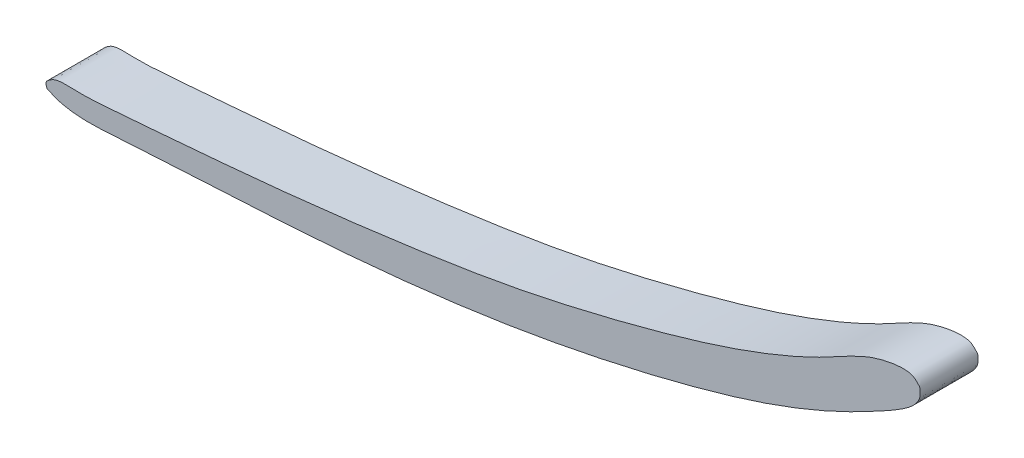
ISO-10303-21;
HEADER;
FILE_DESCRIPTION(('STEP AP214'),'2;1');
FILE_NAME('part.step','',(''),(''),'','','');
FILE_SCHEMA(('AUTOMOTIVE_DESIGN { 1 0 10303 214 1 1 1 1 }'));
ENDSEC;
DATA;
#1=APPLICATION_CONTEXT('core data for automotive mechanical design processes');
#2=APPLICATION_PROTOCOL_DEFINITION('international standard','automotive_design',2000,#1);
#3=PRODUCT_CONTEXT('',#1,'mechanical');
#4=PRODUCT('Part','Part','',(#3));
#5=PRODUCT_RELATED_PRODUCT_CATEGORY('part','',(#4));
#6=PRODUCT_DEFINITION_FORMATION('','',#4);
#7=PRODUCT_DEFINITION_CONTEXT('part definition',#1,'design');
#8=PRODUCT_DEFINITION('design','',#6,#7);
#9=PRODUCT_DEFINITION_SHAPE('','',#8);
#10=(LENGTH_UNIT() NAMED_UNIT(*) SI_UNIT(.MILLI.,.METRE.));
#11=(NAMED_UNIT(*) PLANE_ANGLE_UNIT() SI_UNIT($,.RADIAN.));
#12=(NAMED_UNIT(*) SI_UNIT($,.STERADIAN.) SOLID_ANGLE_UNIT());
#13=UNCERTAINTY_MEASURE_WITH_UNIT(LENGTH_MEASURE(1.E-05),#10,'distance_accuracy_value','');
#14=(GEOMETRIC_REPRESENTATION_CONTEXT(3) GLOBAL_UNCERTAINTY_ASSIGNED_CONTEXT((#13)) GLOBAL_UNIT_ASSIGNED_CONTEXT((#10,
#11,#12)) REPRESENTATION_CONTEXT('',''));
#15=CARTESIAN_POINT('',(0.,0.,0.));
#16=DIRECTION('',(0.,0.,1.));
#17=DIRECTION('',(1.,0.,0.));
#18=AXIS2_PLACEMENT_3D('',#15,#16,#17);
#19=CARTESIAN_POINT('',(67.9244180293989,0.,380.));
#20=CARTESIAN_POINT('',(67.8980827226914,0.0808874846875418,380.));
#21=CARTESIAN_POINT('',(67.8437519870506,0.146183378526621,380.));
#22=CARTESIAN_POINT('',(67.7304105694721,0.269860576595671,380.));
#23=CARTESIAN_POINT('',(67.6701066992551,0.328142792930919,380.));
#24=CARTESIAN_POINT('',(67.4930767753871,0.506789097964422,380.));
#25=CARTESIAN_POINT('',(67.3754815860878,0.627722730379698,380.));
#26=CARTESIAN_POINT('',(67.1814988715481,0.784949433293214,380.));
#27=CARTESIAN_POINT('',(67.1142900629273,0.833628055077473,380.));
#28=CARTESIAN_POINT('',(66.9708815776387,0.91782214535624,380.));
#29=CARTESIAN_POINT('',(66.8942977170675,0.954020744017403,380.));
#30=CARTESIAN_POINT('',(66.6585955543259,1.04458627408283,380.));
#31=CARTESIAN_POINT('',(66.4960970471957,1.08095822861115,380.));
#32=CARTESIAN_POINT('',(66.1659121181836,1.13048393172016,380.));
#33=CARTESIAN_POINT('',(65.9978237521445,1.14287797467205,380.));
#34=CARTESIAN_POINT('',(65.66484948565,1.15506162313816,380.));
#35=CARTESIAN_POINT('',(65.4989041745106,1.1543912544717,380.));
#36=CARTESIAN_POINT('',(65.0024970619218,1.13454779735811,380.));
#37=CARTESIAN_POINT('',(64.673328211938,1.09923807089962,380.));
#38=CARTESIAN_POINT('',(63.688316162584,0.962176359305011,380.));
#39=CARTESIAN_POINT('',(63.0347744470589,0.823029122241969,380.));
#40=CARTESIAN_POINT('',(61.7631205156361,0.476424362996053,380.));
#41=CARTESIAN_POINT('',(61.1416513865985,0.265644883098992,380.));
#42=CARTESIAN_POINT('',(59.3175463598382,-0.471891549475023,380.));
#43=CARTESIAN_POINT('',(58.1516567934419,-1.0946192132435,380.));
#44=CARTESIAN_POINT('',(56.4078281872059,-2.0415569353226,380.));
#45=CARTESIAN_POINT('',(55.8267903228693,-2.35781949207936,380.));
#46=CARTESIAN_POINT('',(54.6590962842587,-2.97580839573625,380.));
#47=CARTESIAN_POINT('',(54.0728248060745,-3.27853006385465,380.));
#48=CARTESIAN_POINT('',(52.3016449875141,-4.1547022057839,380.));
#49=CARTESIAN_POINT('',(51.1052447977944,-4.69841990665093,380.));
#50=CARTESIAN_POINT('',(48.6920494064283,-5.73308745173379,380.));
#51=CARTESIAN_POINT('',(47.4752601060874,-6.22405256435216,380.));
#52=CARTESIAN_POINT('',(43.802122786914,-7.6380367626937,380.));
#53=CARTESIAN_POINT('',(41.3193006166478,-8.49255948112776,380.));
#54=CARTESIAN_POINT('',(36.3035244346295,-10.0718991921712,380.));
#55=CARTESIAN_POINT('',(33.7722339214249,-10.8027024115782,380.));
#56=CARTESIAN_POINT('',(28.6849421482247,-12.1932145904519,380.));
#57=CARTESIAN_POINT('',(26.1305894174891,-12.8490705617333,380.));
#58=CARTESIAN_POINT('',(21.0059725680642,-14.0927192451237,380.));
#59=CARTESIAN_POINT('',(18.4363683137439,-14.6815677266137,380.));
#60=CARTESIAN_POINT('',(13.277492574711,-15.7703722846294,380.));
#61=CARTESIAN_POINT('',(10.6869040238936,-16.2678786080086,380.));
#62=CARTESIAN_POINT('',(5.49185483006941,-17.1706653348124,380.));
#63=CARTESIAN_POINT('',(2.88703857969561,-17.576972694024,380.));
#64=CARTESIAN_POINT('',(-2.3314338448699,-18.3349280893757,380.));
#65=CARTESIAN_POINT('',(-4.94461578611242,-18.6890100645052,380.));
#66=CARTESIAN_POINT('',(-10.174693939845,-19.3631406923846,380.));
#67=CARTESIAN_POINT('',(-12.7921525690243,-19.6810476511114,380.));
#68=CARTESIAN_POINT('',(-18.0321591835003,-20.2765633316638,380.));
#69=CARTESIAN_POINT('',(-20.654566234495,-20.550964155242,380.));
#70=CARTESIAN_POINT('',(-25.9032946001612,-21.0592774586322,380.));
#71=CARTESIAN_POINT('',(-28.5295173927531,-21.2950567597201,380.));
#72=CARTESIAN_POINT('',(-33.7837383558722,-21.7466130770187,380.));
#73=CARTESIAN_POINT('',(-36.4114006599268,-21.966004972311,380.));
#74=CARTESIAN_POINT('',(-40.3533834380296,-22.2890158777061,380.));
#75=CARTESIAN_POINT('',(-41.667553943192,-22.3945127438023,380.));
#76=CARTESIAN_POINT('',(-43.6393465195499,-22.5459233878259,380.));
#77=CARTESIAN_POINT('',(-44.2965407817983,-22.597458987013,380.));
#78=CARTESIAN_POINT('',(-45.6115064645182,-22.6919723447671,380.));
#79=CARTESIAN_POINT('',(-46.269485584589,-22.7353017031554,380.));
#80=CARTESIAN_POINT('',(-47.5870515146375,-22.783315661573,380.));
#81=CARTESIAN_POINT('',(-48.2457845167023,-22.7892769629878,380.));
#82=CARTESIAN_POINT('',(-49.2337857967943,-22.7627426197818,380.));
#83=CARTESIAN_POINT('',(-49.5631030685538,-22.7479425863981,380.));
#84=CARTESIAN_POINT('',(-50.2217925768605,-22.7381947634276,380.));
#85=CARTESIAN_POINT('',(-50.5513862645487,-22.7417875994527,380.));
#86=CARTESIAN_POINT('',(-51.0409658661352,-22.7870841953343,380.));
#87=CARTESIAN_POINT('',(-51.2033952206051,-22.8094190572499,380.));
#88=CARTESIAN_POINT('',(-51.5255736707704,-22.87947916336,380.));
#89=CARTESIAN_POINT('',(-51.6854844122682,-22.9277310801552,380.));
#90=CARTESIAN_POINT('',(-52.1340436819776,-23.1229409127101,380.));
#91=CARTESIAN_POINT('',(-52.4000778156136,-23.3211673184696,380.));
#92=CARTESIAN_POINT('',(-52.7204285614589,-23.5797172412932,380.));
#93=CARTESIAN_POINT('',(-52.7835989471737,-23.6371788054526,380.));
#94=CARTESIAN_POINT('',(-52.8609317331312,-23.783056290879,380.));
#95=CARTESIAN_POINT('',(-52.8776269809649,-23.8681547258022,380.));
#96=CARTESIAN_POINT('',(-52.8715545015156,-24.0335292293888,380.));
#97=CARTESIAN_POINT('',(-52.8543065940292,-24.1140071087037,380.));
#98=CARTESIAN_POINT('',(-52.819816431829,-24.2749637461241,380.));
#99=CARTESIAN_POINT('',(-52.7987122713346,-24.3553434026731,380.));
#100=CARTESIAN_POINT('',(-52.742657187952,-24.4660269903957,380.));
#101=CARTESIAN_POINT('',(-52.7200670390676,-24.5007146199069,380.));
#102=CARTESIAN_POINT('',(-52.6643555107444,-24.5614175002645,380.));
#103=CARTESIAN_POINT('',(-52.6307382072656,-24.5865128134026,380.));
#104=CARTESIAN_POINT('',(-52.5237629838539,-24.6484163666789,380.));
#105=CARTESIAN_POINT('',(-52.4441309452042,-24.6740515357303,380.));
#106=CARTESIAN_POINT('',(-52.2093059160125,-24.753707358067,380.));
#107=CARTESIAN_POINT('',(-52.0558576854918,-24.8148180878672,380.));
#108=CARTESIAN_POINT('',(-51.7507797415351,-24.9424417890892,380.));
#109=CARTESIAN_POINT('',(-51.5987251041437,-25.0080318992665,380.));
#110=CARTESIAN_POINT('',(-51.290772308899,-25.1251004348166,380.));
#111=CARTESIAN_POINT('',(-51.1348283305039,-25.1764106276925,380.));
#112=CARTESIAN_POINT('',(-50.6621648811304,-25.3126020512847,380.));
#113=CARTESIAN_POINT('',(-50.3410490393522,-25.3813417784947,380.));
#114=CARTESIAN_POINT('',(-49.6929316073853,-25.4972114022308,380.));
#115=CARTESIAN_POINT('',(-49.3650582179808,-25.5440624306643,380.));
#116=CARTESIAN_POINT('',(-48.7111807635962,-25.6162860552686,380.));
#117=CARTESIAN_POINT('',(-48.3844158061056,-25.6417629071474,380.));
#118=CARTESIAN_POINT('',(-47.4045544693038,-25.6916604443526,380.));
#119=CARTESIAN_POINT('',(-46.7518807319356,-25.6902148233248,380.));
#120=CARTESIAN_POINT('',(-45.4470076893009,-25.658287641293,380.));
#121=CARTESIAN_POINT('',(-44.7948204891251,-25.6270652309978,380.));
#122=CARTESIAN_POINT('',(-42.8385442609433,-25.5159327943076,380.));
#123=CARTESIAN_POINT('',(-41.5347008586148,-25.4233457781483,380.));
#124=CARTESIAN_POINT('',(-38.9266033551757,-25.252628281677,380.));
#125=CARTESIAN_POINT('',(-37.6222865569631,-25.1718480158558,380.));
#126=CARTESIAN_POINT('',(-33.7083709871079,-24.9459933052223,380.));
#127=CARTESIAN_POINT('',(-31.09784190331,-24.8168154822398,380.));
#128=CARTESIAN_POINT('',(-25.8774191166827,-24.5476030146287,380.));
#129=CARTESIAN_POINT('',(-23.2675635611287,-24.4068889053126,380.));
#130=CARTESIAN_POINT('',(-15.4412738590346,-23.9284982139152,380.));
#131=CARTESIAN_POINT('',(-10.227975643508,-23.5297512921371,380.));
#132=CARTESIAN_POINT('',(0.171861577279261,-22.4787884299001,380.));
#133=CARTESIAN_POINT('',(5.36158421555895,-21.8286977470625,380.));
#134=CARTESIAN_POINT('',(15.6861379450761,-20.2077649700896,380.));
#135=CARTESIAN_POINT('',(20.8250483209451,-19.2342938444913,380.));
#136=CARTESIAN_POINT('',(28.4842509671916,-17.5503560973159,380.));
#137=CARTESIAN_POINT('',(31.0289682578763,-16.9526079214017,380.));
#138=CARTESIAN_POINT('',(36.0951670774016,-15.6736609981585,380.));
#139=CARTESIAN_POINT('',(38.6173290505716,-14.9929346244229,380.));
#140=CARTESIAN_POINT('',(43.6299990832301,-13.5120922824956,380.));
#141=CARTESIAN_POINT('',(46.1208815122643,-12.7102674049742,380.));
#142=CARTESIAN_POINT('',(51.0348905763456,-10.9288799551273,380.));
#143=CARTESIAN_POINT('',(53.460709519367,-9.94493226941651,380.));
#144=CARTESIAN_POINT('',(58.216695925139,-7.77139023146861,380.));
#145=CARTESIAN_POINT('',(60.5482348546552,-6.58039438604385,380.));
#146=CARTESIAN_POINT('',(63.407986552383,-4.99579766464203,380.));
#147=CARTESIAN_POINT('',(63.9773652085571,-4.6737798244359,380.));
#148=CARTESIAN_POINT('',(64.8197193275285,-4.17151824312584,380.));
#149=CARTESIAN_POINT('',(65.0981769738753,-4.00033252500465,380.));
#150=CARTESIAN_POINT('',(65.6471020402947,-3.64503287526685,380.));
#151=CARTESIAN_POINT('',(65.918296833539,-3.4613934899273,380.));
#152=CARTESIAN_POINT('',(66.440436881978,-3.07157367314159,380.));
#153=CARTESIAN_POINT('',(66.6917500987747,-2.86521847424187,380.));
#154=CARTESIAN_POINT('',(67.1607368865974,-2.41304685703808,380.));
#155=CARTESIAN_POINT('',(67.3792315044415,-2.16317357826379,380.));
#156=CARTESIAN_POINT('',(67.6532757442726,-1.75518143493458,380.));
#157=CARTESIAN_POINT('',(67.7366153324638,-1.61301989194684,380.));
#158=CARTESIAN_POINT('',(67.8723550774667,-1.3121248681926,380.));
#159=CARTESIAN_POINT('',(67.9239269601411,-1.15720611076292,380.));
#160=CARTESIAN_POINT('',(67.9681872852655,-0.831214314116757,380.));
#161=CARTESIAN_POINT('',(67.9575759373682,-0.662942903009611,380.));
#162=CARTESIAN_POINT('',(67.9454282445663,-0.414328954666865,380.));
#163=CARTESIAN_POINT('',(67.9450805277485,-0.33132380475509,380.));
#164=CARTESIAN_POINT('',(67.9464783944526,-0.165237818516351,380.));
#165=CARTESIAN_POINT('',(67.9507533361064,-0.0808874846875418,380.));
#166=CARTESIAN_POINT('',(67.9244180293989,0.,380.));
#167=B_SPLINE_CURVE_WITH_KNOTS('',3,(#19,#20,#21,#22,#23,#24,#25,#26,#27,#28,#29,#30,#31,#32,
#33,#34,#35,#36,#37,#38,#39,#40,#41,#42,#43,#44,#45,#46,#47,#48,#49,#50,#51,#52,#53,#54,#55,#56,
#57,#58,#59,#60,#61,#62,#63,#64,#65,#66,#67,#68,#69,#70,#71,#72,#73,#74,#75,#76,#77,#78,#79,#80,
#81,#82,#83,#84,#85,#86,#87,#88,#89,#90,#91,#92,#93,#94,#95,#96,#97,#98,#99,#100,#101,#102,#103,
#104,#105,#106,#107,#108,#109,#110,#111,#112,#113,#114,#115,#116,#117,#118,#119,#120,#121,#122,
#123,#124,#125,#126,#127,#128,#129,#130,#131,#132,#133,#134,#135,#136,#137,#138,#139,#140,#141,
#142,#143,#144,#145,#146,#147,#148,#149,#150,#151,#152,#153,#154,#155,#156,#157,#158,#159,#160,
#161,#162,#163,#164,#165,#166),.UNSPECIFIED.,.T.,.F.,(4,2,2,2,2,2,2,2,2,2,2,2,2,2,2,2,2,2,2,2,2,
2,2,2,2,2,2,2,2,2,2,2,2,2,2,2,2,2,2,2,2,2,2,2,2,2,2,2,2,2,2,2,2,2,2,2,2,2,2,2,2,2,2,2,2,2,2,2,2,
2,2,2,2,4),(0.,0.000976562499999842,0.00195312499999968,0.00390624999999948,0.00488281249999938,
0.00585937499999928,0.00781249999999923,0.00976562499999918,0.0117187499999991,
0.0156249999999992,0.0234374999999991,0.0312499999999991,0.0468749999999989,0.0546874999999989,
0.0624999999999988,0.0781249999999985,0.0937499999999983,0.124999999999998,0.156249999999998,
0.187499999999997,0.218749999999997,0.249999999999996,0.281249999999996,0.312499999999996,
0.343749999999995,0.374999999999995,0.406249999999995,0.437499999999995,0.453124999999994,
0.460937499999994,0.468749999999994,0.476562499999994,0.480468749999994,0.484374999999994,
0.486328124999994,0.488281249999994,0.492187499999994,0.493164062499994,0.494140624999994,
0.495117187499994,0.496093749999994,0.496582031249994,0.497070312499994,0.498046874999994,
0.499999999999994,0.501953124999994,0.503906249999994,0.507812499999994,0.511718749999994,
0.515624999999994,0.523437499999994,0.531249999999994,0.546874999999995,0.562499999999995,
0.593749999999995,0.624999999999996,0.687499999999996,0.749999999999997,0.812499999999998,
0.843749999999998,0.874999999999998,0.906249999999998,0.937499999999999,0.968749999999999,
0.976562499999999,0.980468749999999,0.984375,0.98828125,0.9921875,0.994140625,0.99609375,
0.998046875,0.9990234375,1.),.UNSPECIFIED.);
#168=DIRECTION('',(0.,0.,-1.));
#169=VECTOR('',#168,1.);
#170=SURFACE_OF_LINEAR_EXTRUSION('',#167,#169);
#171=CARTESIAN_POINT('',(67.9244180293989,0.,380.));
#172=CARTESIAN_POINT('',(67.9507533361064,-0.0808874846875418,380.));
#173=CARTESIAN_POINT('',(67.9464783944526,-0.165237818516351,380.));
#174=CARTESIAN_POINT('',(67.9450805277485,-0.33132380475509,380.));
#175=CARTESIAN_POINT('',(67.9454282445663,-0.414328954666865,380.));
#176=CARTESIAN_POINT('',(67.9575759373682,-0.662942903009611,380.));
#177=CARTESIAN_POINT('',(67.9681872852655,-0.831214314116757,380.));
#178=CARTESIAN_POINT('',(67.9239269601411,-1.15720611076292,380.));
#179=CARTESIAN_POINT('',(67.8723550774667,-1.3121248681926,380.));
#180=CARTESIAN_POINT('',(67.7366153324638,-1.61301989194684,380.));
#181=CARTESIAN_POINT('',(67.6532757442726,-1.75518143493458,380.));
#182=CARTESIAN_POINT('',(67.3792315044415,-2.16317357826379,380.));
#183=CARTESIAN_POINT('',(67.1607368865974,-2.41304685703808,380.));
#184=CARTESIAN_POINT('',(66.6917500987747,-2.86521847424187,380.));
#185=CARTESIAN_POINT('',(66.440436881978,-3.07157367314159,380.));
#186=CARTESIAN_POINT('',(65.918296833539,-3.4613934899273,380.));
#187=CARTESIAN_POINT('',(65.6471020402947,-3.64503287526685,380.));
#188=CARTESIAN_POINT('',(65.0981769738753,-4.00033252500465,380.));
#189=CARTESIAN_POINT('',(64.8197193275285,-4.17151824312584,380.));
#190=CARTESIAN_POINT('',(63.9773652085571,-4.6737798244359,380.));
#191=CARTESIAN_POINT('',(63.407986552383,-4.99579766464203,380.));
#192=CARTESIAN_POINT('',(60.5482348546552,-6.58039438604385,380.));
#193=CARTESIAN_POINT('',(58.216695925139,-7.77139023146861,380.));
#194=CARTESIAN_POINT('',(53.460709519367,-9.94493226941651,380.));
#195=CARTESIAN_POINT('',(51.0348905763456,-10.9288799551273,380.));
#196=CARTESIAN_POINT('',(46.1208815122643,-12.7102674049742,380.));
#197=CARTESIAN_POINT('',(43.6299990832301,-13.5120922824956,380.));
#198=CARTESIAN_POINT('',(38.6173290505716,-14.9929346244229,380.));
#199=CARTESIAN_POINT('',(36.0951670774016,-15.6736609981585,380.));
#200=CARTESIAN_POINT('',(31.0289682578763,-16.9526079214017,380.));
#201=CARTESIAN_POINT('',(28.4842509671916,-17.5503560973159,380.));
#202=CARTESIAN_POINT('',(20.8250483209451,-19.2342938444913,380.));
#203=CARTESIAN_POINT('',(15.6861379450761,-20.2077649700896,380.));
#204=CARTESIAN_POINT('',(5.36158421555895,-21.8286977470625,380.));
#205=CARTESIAN_POINT('',(0.171861577279261,-22.4787884299001,380.));
#206=CARTESIAN_POINT('',(-10.227975643508,-23.5297512921371,380.));
#207=CARTESIAN_POINT('',(-15.4412738590346,-23.9284982139152,380.));
#208=CARTESIAN_POINT('',(-23.2675635611287,-24.4068889053126,380.));
#209=CARTESIAN_POINT('',(-25.8774191166827,-24.5476030146287,380.));
#210=CARTESIAN_POINT('',(-31.09784190331,-24.8168154822398,380.));
#211=CARTESIAN_POINT('',(-33.7083709871079,-24.9459933052223,380.));
#212=CARTESIAN_POINT('',(-37.6222865569631,-25.1718480158558,380.));
#213=CARTESIAN_POINT('',(-38.9266033551757,-25.252628281677,380.));
#214=CARTESIAN_POINT('',(-41.5347008586148,-25.4233457781483,380.));
#215=CARTESIAN_POINT('',(-42.8385442609433,-25.5159327943076,380.));
#216=CARTESIAN_POINT('',(-44.7948204891251,-25.6270652309978,380.));
#217=CARTESIAN_POINT('',(-45.4470076893009,-25.658287641293,380.));
#218=CARTESIAN_POINT('',(-46.7518807319356,-25.6902148233248,380.));
#219=CARTESIAN_POINT('',(-47.4045544693038,-25.6916604443526,380.));
#220=CARTESIAN_POINT('',(-48.3844158061056,-25.6417629071474,380.));
#221=CARTESIAN_POINT('',(-48.7111807635962,-25.6162860552686,380.));
#222=CARTESIAN_POINT('',(-49.3650582179808,-25.5440624306643,380.));
#223=CARTESIAN_POINT('',(-49.6929316073853,-25.4972114022308,380.));
#224=CARTESIAN_POINT('',(-50.3410490393522,-25.3813417784947,380.));
#225=CARTESIAN_POINT('',(-50.6621648811304,-25.3126020512847,380.));
#226=CARTESIAN_POINT('',(-51.1348283305039,-25.1764106276925,380.));
#227=CARTESIAN_POINT('',(-51.290772308899,-25.1251004348166,380.));
#228=CARTESIAN_POINT('',(-51.5987251041437,-25.0080318992665,380.));
#229=CARTESIAN_POINT('',(-51.7507797415351,-24.9424417890892,380.));
#230=CARTESIAN_POINT('',(-52.0558576854918,-24.8148180878672,380.));
#231=CARTESIAN_POINT('',(-52.2093059160125,-24.753707358067,380.));
#232=CARTESIAN_POINT('',(-52.4441309452042,-24.6740515357303,380.));
#233=CARTESIAN_POINT('',(-52.5237629838539,-24.6484163666789,380.));
#234=CARTESIAN_POINT('',(-52.6307382072656,-24.5865128134026,380.));
#235=CARTESIAN_POINT('',(-52.6643555107444,-24.5614175002645,380.));
#236=CARTESIAN_POINT('',(-52.7200670390676,-24.5007146199069,380.));
#237=CARTESIAN_POINT('',(-52.742657187952,-24.4660269903957,380.));
#238=CARTESIAN_POINT('',(-52.7987122713346,-24.3553434026731,380.));
#239=CARTESIAN_POINT('',(-52.819816431829,-24.2749637461241,380.));
#240=CARTESIAN_POINT('',(-52.8543065940292,-24.1140071087037,380.));
#241=CARTESIAN_POINT('',(-52.8715545015156,-24.0335292293888,380.));
#242=CARTESIAN_POINT('',(-52.8776269809649,-23.8681547258022,380.));
#243=CARTESIAN_POINT('',(-52.8609317331312,-23.783056290879,380.));
#244=CARTESIAN_POINT('',(-52.7835989471737,-23.6371788054526,380.));
#245=CARTESIAN_POINT('',(-52.7204285614589,-23.5797172412932,380.));
#246=CARTESIAN_POINT('',(-52.4000778156136,-23.3211673184696,380.));
#247=CARTESIAN_POINT('',(-52.1340436819776,-23.1229409127101,380.));
#248=CARTESIAN_POINT('',(-51.6854844122682,-22.9277310801552,380.));
#249=CARTESIAN_POINT('',(-51.5255736707704,-22.87947916336,380.));
#250=CARTESIAN_POINT('',(-51.2033952206051,-22.8094190572499,380.));
#251=CARTESIAN_POINT('',(-51.0409658661352,-22.7870841953343,380.));
#252=CARTESIAN_POINT('',(-50.5513862645487,-22.7417875994527,380.));
#253=CARTESIAN_POINT('',(-50.2217925768605,-22.7381947634276,380.));
#254=CARTESIAN_POINT('',(-49.5631030685538,-22.7479425863981,380.));
#255=CARTESIAN_POINT('',(-49.2337857967943,-22.7627426197818,380.));
#256=CARTESIAN_POINT('',(-48.2457845167023,-22.7892769629878,380.));
#257=CARTESIAN_POINT('',(-47.5870515146375,-22.783315661573,380.));
#258=CARTESIAN_POINT('',(-46.269485584589,-22.7353017031554,380.));
#259=CARTESIAN_POINT('',(-45.6115064645182,-22.6919723447671,380.));
#260=CARTESIAN_POINT('',(-44.2965407817983,-22.597458987013,380.));
#261=CARTESIAN_POINT('',(-43.6393465195499,-22.5459233878259,380.));
#262=CARTESIAN_POINT('',(-41.667553943192,-22.3945127438023,380.));
#263=CARTESIAN_POINT('',(-40.3533834380296,-22.2890158777061,380.));
#264=CARTESIAN_POINT('',(-36.4114006599268,-21.966004972311,380.));
#265=CARTESIAN_POINT('',(-33.7837383558722,-21.7466130770187,380.));
#266=CARTESIAN_POINT('',(-28.5295173927531,-21.2950567597201,380.));
#267=CARTESIAN_POINT('',(-25.9032946001612,-21.0592774586322,380.));
#268=CARTESIAN_POINT('',(-20.654566234495,-20.550964155242,380.));
#269=CARTESIAN_POINT('',(-18.0321591835003,-20.2765633316638,380.));
#270=CARTESIAN_POINT('',(-12.7921525690243,-19.6810476511114,380.));
#271=CARTESIAN_POINT('',(-10.174693939845,-19.3631406923846,380.));
#272=CARTESIAN_POINT('',(-4.94461578611242,-18.6890100645052,380.));
#273=CARTESIAN_POINT('',(-2.3314338448699,-18.3349280893757,380.));
#274=CARTESIAN_POINT('',(2.88703857969561,-17.576972694024,380.));
#275=CARTESIAN_POINT('',(5.49185483006941,-17.1706653348124,380.));
#276=CARTESIAN_POINT('',(10.6869040238936,-16.2678786080086,380.));
#277=CARTESIAN_POINT('',(13.277492574711,-15.7703722846294,380.));
#278=CARTESIAN_POINT('',(18.4363683137439,-14.6815677266137,380.));
#279=CARTESIAN_POINT('',(21.0059725680642,-14.0927192451237,380.));
#280=CARTESIAN_POINT('',(26.1305894174891,-12.8490705617333,380.));
#281=CARTESIAN_POINT('',(28.6849421482247,-12.1932145904519,380.));
#282=CARTESIAN_POINT('',(33.7722339214249,-10.8027024115782,380.));
#283=CARTESIAN_POINT('',(36.3035244346295,-10.0718991921712,380.));
#284=CARTESIAN_POINT('',(41.3193006166478,-8.49255948112776,380.));
#285=CARTESIAN_POINT('',(43.802122786914,-7.6380367626937,380.));
#286=CARTESIAN_POINT('',(47.4752601060874,-6.22405256435216,380.));
#287=CARTESIAN_POINT('',(48.6920494064283,-5.73308745173379,380.));
#288=CARTESIAN_POINT('',(51.1052447977944,-4.69841990665093,380.));
#289=CARTESIAN_POINT('',(52.3016449875141,-4.1547022057839,380.));
#290=CARTESIAN_POINT('',(54.0728248060745,-3.27853006385465,380.));
#291=CARTESIAN_POINT('',(54.6590962842587,-2.97580839573625,380.));
#292=CARTESIAN_POINT('',(55.8267903228693,-2.35781949207936,380.));
#293=CARTESIAN_POINT('',(56.4078281872059,-2.0415569353226,380.));
#294=CARTESIAN_POINT('',(58.1516567934419,-1.0946192132435,380.));
#295=CARTESIAN_POINT('',(59.3175463598382,-0.471891549475023,380.));
#296=CARTESIAN_POINT('',(61.1416513865985,0.265644883098992,380.));
#297=CARTESIAN_POINT('',(61.7631205156361,0.476424362996053,380.));
#298=CARTESIAN_POINT('',(63.0347744470589,0.823029122241969,380.));
#299=CARTESIAN_POINT('',(63.688316162584,0.962176359305011,380.));
#300=CARTESIAN_POINT('',(64.673328211938,1.09923807089962,380.));
#301=CARTESIAN_POINT('',(65.0024970619218,1.13454779735811,380.));
#302=CARTESIAN_POINT('',(65.4989041745106,1.1543912544717,380.));
#303=CARTESIAN_POINT('',(65.66484948565,1.15506162313816,380.));
#304=CARTESIAN_POINT('',(65.9978237521445,1.14287797467205,380.));
#305=CARTESIAN_POINT('',(66.1659121181836,1.13048393172016,380.));
#306=CARTESIAN_POINT('',(66.4960970471957,1.08095822861115,380.));
#307=CARTESIAN_POINT('',(66.6585955543259,1.04458627408283,380.));
#308=CARTESIAN_POINT('',(66.8942977170675,0.954020744017403,380.));
#309=CARTESIAN_POINT('',(66.9708815776387,0.91782214535624,380.));
#310=CARTESIAN_POINT('',(67.1142900629273,0.833628055077473,380.));
#311=CARTESIAN_POINT('',(67.1814988715481,0.784949433293214,380.));
#312=CARTESIAN_POINT('',(67.3754815860878,0.627722730379698,380.));
#313=CARTESIAN_POINT('',(67.4930767753871,0.506789097964422,380.));
#314=CARTESIAN_POINT('',(67.6701066992551,0.328142792930919,380.));
#315=CARTESIAN_POINT('',(67.7304105694721,0.269860576595671,380.));
#316=CARTESIAN_POINT('',(67.8437519870506,0.146183378526621,380.));
#317=CARTESIAN_POINT('',(67.8980827226914,0.0808874846875418,380.));
#318=CARTESIAN_POINT('',(67.9244180293989,0.,380.));
#319=B_SPLINE_CURVE_WITH_KNOTS('',3,(#171,#172,#173,#174,#175,#176,#177,#178,#179,#180,#181,
#182,#183,#184,#185,#186,#187,#188,#189,#190,#191,#192,#193,#194,#195,#196,#197,#198,#199,#200,
#201,#202,#203,#204,#205,#206,#207,#208,#209,#210,#211,#212,#213,#214,#215,#216,#217,#218,#219,
#220,#221,#222,#223,#224,#225,#226,#227,#228,#229,#230,#231,#232,#233,#234,#235,#236,#237,#238,
#239,#240,#241,#242,#243,#244,#245,#246,#247,#248,#249,#250,#251,#252,#253,#254,#255,#256,#257,
#258,#259,#260,#261,#262,#263,#264,#265,#266,#267,#268,#269,#270,#271,#272,#273,#274,#275,#276,
#277,#278,#279,#280,#281,#282,#283,#284,#285,#286,#287,#288,#289,#290,#291,#292,#293,#294,#295,
#296,#297,#298,#299,#300,#301,#302,#303,#304,#305,#306,#307,#308,#309,#310,#311,#312,#313,#314,
#315,#316,#317,#318),.UNSPECIFIED.,.T.,.F.,(4,2,2,2,2,2,2,2,2,2,2,2,2,2,2,2,2,2,2,2,2,2,2,2,2,2,
2,2,2,2,2,2,2,2,2,2,2,2,2,2,2,2,2,2,2,2,2,2,2,2,2,2,2,2,2,2,2,2,2,2,2,2,2,2,2,2,2,2,2,2,2,2,2,
4),(0.,0.000976562500000111,0.00195312500000011,0.00390625000000011,0.00585937500000011,
0.00781250000000022,0.0117187500000003,0.0156250000000004,0.0195312500000007,0.0234375000000008,
0.031250000000001,0.0625000000000012,0.0937500000000016,0.125000000000002,0.156250000000002,
0.187500000000002,0.250000000000003,0.312500000000004,0.375000000000004,0.406250000000005,
0.437500000000005,0.453125000000005,0.468750000000006,0.476562500000006,0.484375000000006,
0.488281250000006,0.492187500000006,0.496093750000006,0.498046875000006,0.500000000000006,
0.501953125000006,0.502929687500006,0.503417968750006,0.503906250000006,0.504882812500006,
0.505859375000006,0.506835937500006,0.507812500000006,0.511718750000006,0.513671875000006,
0.515625000000006,0.519531250000006,0.523437500000006,0.531250000000006,0.539062500000006,
0.546875000000006,0.562500000000005,0.593750000000005,0.625000000000005,0.656250000000005,
0.687500000000004,0.718750000000004,0.750000000000004,0.781250000000003,0.812500000000003,
0.843750000000002,0.875000000000002,0.906250000000002,0.921875000000001,0.937500000000001,
0.945312500000001,0.953125000000001,0.968750000000001,0.976562500000001,0.984375000000001,
0.988281250000001,0.990234375000001,0.992187500000001,0.994140625000001,0.995117187500001,
0.996093750000001,0.998046875,0.9990234375,1.),.UNSPECIFIED.);
#320=CARTESIAN_POINT('',(67.9244180293989,0.,380.));
#321=VERTEX_POINT('',#320);
#322=EDGE_CURVE('E10',#321,#321,#319,.F.);
#323=ORIENTED_EDGE('',*,*,#322,.F.);
#324=EDGE_LOOP('',(#323));
#325=FACE_BOUND('',#324,.T.);
#326=CARTESIAN_POINT('',(67.9244180293989,0.,372.));
#327=CARTESIAN_POINT('',(67.8980827226914,0.0808874846875418,372.));
#328=CARTESIAN_POINT('',(67.8437519870506,0.146183378526621,372.));
#329=CARTESIAN_POINT('',(67.7304105694721,0.269860576595671,372.));
#330=CARTESIAN_POINT('',(67.6701066992551,0.328142792930919,372.));
#331=CARTESIAN_POINT('',(67.4930767753871,0.506789097964422,372.));
#332=CARTESIAN_POINT('',(67.3754815860878,0.627722730379698,372.));
#333=CARTESIAN_POINT('',(67.1814988715481,0.784949433293214,372.));
#334=CARTESIAN_POINT('',(67.1142900629273,0.833628055077473,372.));
#335=CARTESIAN_POINT('',(66.9708815776387,0.91782214535624,372.));
#336=CARTESIAN_POINT('',(66.8942977170675,0.954020744017403,372.));
#337=CARTESIAN_POINT('',(66.6585955543259,1.04458627408283,372.));
#338=CARTESIAN_POINT('',(66.4960970471957,1.08095822861115,372.));
#339=CARTESIAN_POINT('',(66.1659121181836,1.13048393172016,372.));
#340=CARTESIAN_POINT('',(65.9978237521445,1.14287797467205,372.));
#341=CARTESIAN_POINT('',(65.66484948565,1.15506162313816,372.));
#342=CARTESIAN_POINT('',(65.4989041745106,1.1543912544717,372.));
#343=CARTESIAN_POINT('',(65.0024970619218,1.13454779735811,372.));
#344=CARTESIAN_POINT('',(64.673328211938,1.09923807089962,372.));
#345=CARTESIAN_POINT('',(63.688316162584,0.962176359305011,372.));
#346=CARTESIAN_POINT('',(63.0347744470589,0.823029122241969,372.));
#347=CARTESIAN_POINT('',(61.7631205156361,0.476424362996053,372.));
#348=CARTESIAN_POINT('',(61.1416513865985,0.265644883098992,372.));
#349=CARTESIAN_POINT('',(59.3175463598382,-0.471891549475023,372.));
#350=CARTESIAN_POINT('',(58.1516567934419,-1.0946192132435,372.));
#351=CARTESIAN_POINT('',(56.4078281872059,-2.0415569353226,372.));
#352=CARTESIAN_POINT('',(55.8267903228693,-2.35781949207936,372.));
#353=CARTESIAN_POINT('',(54.6590962842587,-2.97580839573625,372.));
#354=CARTESIAN_POINT('',(54.0728248060745,-3.27853006385465,372.));
#355=CARTESIAN_POINT('',(52.3016449875141,-4.1547022057839,372.));
#356=CARTESIAN_POINT('',(51.1052447977944,-4.69841990665093,372.));
#357=CARTESIAN_POINT('',(48.6920494064283,-5.73308745173379,372.));
#358=CARTESIAN_POINT('',(47.4752601060874,-6.22405256435216,372.));
#359=CARTESIAN_POINT('',(43.802122786914,-7.6380367626937,372.));
#360=CARTESIAN_POINT('',(41.3193006166478,-8.49255948112776,372.));
#361=CARTESIAN_POINT('',(36.3035244346295,-10.0718991921712,372.));
#362=CARTESIAN_POINT('',(33.7722339214249,-10.8027024115782,372.));
#363=CARTESIAN_POINT('',(28.6849421482247,-12.1932145904519,372.));
#364=CARTESIAN_POINT('',(26.1305894174891,-12.8490705617333,372.));
#365=CARTESIAN_POINT('',(21.0059725680642,-14.0927192451237,372.));
#366=CARTESIAN_POINT('',(18.4363683137439,-14.6815677266137,372.));
#367=CARTESIAN_POINT('',(13.277492574711,-15.7703722846294,372.));
#368=CARTESIAN_POINT('',(10.6869040238936,-16.2678786080086,372.));
#369=CARTESIAN_POINT('',(5.49185483006941,-17.1706653348124,372.));
#370=CARTESIAN_POINT('',(2.88703857969561,-17.576972694024,372.));
#371=CARTESIAN_POINT('',(-2.3314338448699,-18.3349280893757,372.));
#372=CARTESIAN_POINT('',(-4.94461578611242,-18.6890100645052,372.));
#373=CARTESIAN_POINT('',(-10.174693939845,-19.3631406923846,372.));
#374=CARTESIAN_POINT('',(-12.7921525690243,-19.6810476511114,372.));
#375=CARTESIAN_POINT('',(-18.0321591835003,-20.2765633316638,372.));
#376=CARTESIAN_POINT('',(-20.654566234495,-20.550964155242,372.));
#377=CARTESIAN_POINT('',(-25.9032946001612,-21.0592774586322,372.));
#378=CARTESIAN_POINT('',(-28.5295173927531,-21.2950567597201,372.));
#379=CARTESIAN_POINT('',(-33.7837383558722,-21.7466130770187,372.));
#380=CARTESIAN_POINT('',(-36.4114006599268,-21.966004972311,372.));
#381=CARTESIAN_POINT('',(-40.3533834380296,-22.2890158777061,372.));
#382=CARTESIAN_POINT('',(-41.667553943192,-22.3945127438023,372.));
#383=CARTESIAN_POINT('',(-43.6393465195499,-22.5459233878259,372.));
#384=CARTESIAN_POINT('',(-44.2965407817983,-22.597458987013,372.));
#385=CARTESIAN_POINT('',(-45.6115064645182,-22.6919723447671,372.));
#386=CARTESIAN_POINT('',(-46.269485584589,-22.7353017031554,372.));
#387=CARTESIAN_POINT('',(-47.5870515146375,-22.783315661573,372.));
#388=CARTESIAN_POINT('',(-48.2457845167023,-22.7892769629878,372.));
#389=CARTESIAN_POINT('',(-49.2337857967943,-22.7627426197818,372.));
#390=CARTESIAN_POINT('',(-49.5631030685538,-22.7479425863981,372.));
#391=CARTESIAN_POINT('',(-50.2217925768605,-22.7381947634276,372.));
#392=CARTESIAN_POINT('',(-50.5513862645487,-22.7417875994527,372.));
#393=CARTESIAN_POINT('',(-51.0409658661352,-22.7870841953343,372.));
#394=CARTESIAN_POINT('',(-51.2033952206051,-22.8094190572499,372.));
#395=CARTESIAN_POINT('',(-51.5255736707704,-22.87947916336,372.));
#396=CARTESIAN_POINT('',(-51.6854844122682,-22.9277310801552,372.));
#397=CARTESIAN_POINT('',(-52.1340436819776,-23.1229409127101,372.));
#398=CARTESIAN_POINT('',(-52.4000778156136,-23.3211673184696,372.));
#399=CARTESIAN_POINT('',(-52.7204285614589,-23.5797172412932,372.));
#400=CARTESIAN_POINT('',(-52.7835989471737,-23.6371788054526,372.));
#401=CARTESIAN_POINT('',(-52.8609317331312,-23.783056290879,372.));
#402=CARTESIAN_POINT('',(-52.8776269809649,-23.8681547258022,372.));
#403=CARTESIAN_POINT('',(-52.8715545015156,-24.0335292293888,372.));
#404=CARTESIAN_POINT('',(-52.8543065940292,-24.1140071087037,372.));
#405=CARTESIAN_POINT('',(-52.819816431829,-24.2749637461241,372.));
#406=CARTESIAN_POINT('',(-52.7987122713346,-24.3553434026731,372.));
#407=CARTESIAN_POINT('',(-52.742657187952,-24.4660269903957,372.));
#408=CARTESIAN_POINT('',(-52.7200670390676,-24.5007146199069,372.));
#409=CARTESIAN_POINT('',(-52.6643555107444,-24.5614175002645,372.));
#410=CARTESIAN_POINT('',(-52.6307382072656,-24.5865128134026,372.));
#411=CARTESIAN_POINT('',(-52.5237629838539,-24.6484163666789,372.));
#412=CARTESIAN_POINT('',(-52.4441309452042,-24.6740515357303,372.));
#413=CARTESIAN_POINT('',(-52.2093059160125,-24.753707358067,372.));
#414=CARTESIAN_POINT('',(-52.0558576854918,-24.8148180878672,372.));
#415=CARTESIAN_POINT('',(-51.7507797415351,-24.9424417890892,372.));
#416=CARTESIAN_POINT('',(-51.5987251041437,-25.0080318992665,372.));
#417=CARTESIAN_POINT('',(-51.290772308899,-25.1251004348166,372.));
#418=CARTESIAN_POINT('',(-51.1348283305039,-25.1764106276925,372.));
#419=CARTESIAN_POINT('',(-50.6621648811304,-25.3126020512847,372.));
#420=CARTESIAN_POINT('',(-50.3410490393522,-25.3813417784947,372.));
#421=CARTESIAN_POINT('',(-49.6929316073853,-25.4972114022308,372.));
#422=CARTESIAN_POINT('',(-49.3650582179808,-25.5440624306643,372.));
#423=CARTESIAN_POINT('',(-48.7111807635962,-25.6162860552686,372.));
#424=CARTESIAN_POINT('',(-48.3844158061056,-25.6417629071474,372.));
#425=CARTESIAN_POINT('',(-47.4045544693038,-25.6916604443526,372.));
#426=CARTESIAN_POINT('',(-46.7518807319356,-25.6902148233248,372.));
#427=CARTESIAN_POINT('',(-45.4470076893009,-25.658287641293,372.));
#428=CARTESIAN_POINT('',(-44.7948204891251,-25.6270652309978,372.));
#429=CARTESIAN_POINT('',(-42.8385442609433,-25.5159327943076,372.));
#430=CARTESIAN_POINT('',(-41.5347008586148,-25.4233457781483,372.));
#431=CARTESIAN_POINT('',(-38.9266033551757,-25.252628281677,372.));
#432=CARTESIAN_POINT('',(-37.6222865569631,-25.1718480158558,372.));
#433=CARTESIAN_POINT('',(-33.7083709871079,-24.9459933052223,372.));
#434=CARTESIAN_POINT('',(-31.09784190331,-24.8168154822398,372.));
#435=CARTESIAN_POINT('',(-25.8774191166827,-24.5476030146287,372.));
#436=CARTESIAN_POINT('',(-23.2675635611287,-24.4068889053126,372.));
#437=CARTESIAN_POINT('',(-15.4412738590346,-23.9284982139152,372.));
#438=CARTESIAN_POINT('',(-10.227975643508,-23.5297512921371,372.));
#439=CARTESIAN_POINT('',(0.171861577279261,-22.4787884299001,372.));
#440=CARTESIAN_POINT('',(5.36158421555895,-21.8286977470625,372.));
#441=CARTESIAN_POINT('',(15.6861379450761,-20.2077649700896,372.));
#442=CARTESIAN_POINT('',(20.8250483209451,-19.2342938444913,372.));
#443=CARTESIAN_POINT('',(28.4842509671916,-17.5503560973159,372.));
#444=CARTESIAN_POINT('',(31.0289682578763,-16.9526079214017,372.));
#445=CARTESIAN_POINT('',(36.0951670774016,-15.6736609981585,372.));
#446=CARTESIAN_POINT('',(38.6173290505716,-14.9929346244229,372.));
#447=CARTESIAN_POINT('',(43.6299990832301,-13.5120922824956,372.));
#448=CARTESIAN_POINT('',(46.1208815122643,-12.7102674049742,372.));
#449=CARTESIAN_POINT('',(51.0348905763456,-10.9288799551273,372.));
#450=CARTESIAN_POINT('',(53.460709519367,-9.94493226941651,372.));
#451=CARTESIAN_POINT('',(58.216695925139,-7.77139023146861,372.));
#452=CARTESIAN_POINT('',(60.5482348546552,-6.58039438604385,372.));
#453=CARTESIAN_POINT('',(63.407986552383,-4.99579766464203,372.));
#454=CARTESIAN_POINT('',(63.9773652085571,-4.6737798244359,372.));
#455=CARTESIAN_POINT('',(64.8197193275285,-4.17151824312584,372.));
#456=CARTESIAN_POINT('',(65.0981769738753,-4.00033252500465,372.));
#457=CARTESIAN_POINT('',(65.6471020402947,-3.64503287526685,372.));
#458=CARTESIAN_POINT('',(65.918296833539,-3.4613934899273,372.));
#459=CARTESIAN_POINT('',(66.440436881978,-3.07157367314159,372.));
#460=CARTESIAN_POINT('',(66.6917500987747,-2.86521847424187,372.));
#461=CARTESIAN_POINT('',(67.1607368865974,-2.41304685703808,372.));
#462=CARTESIAN_POINT('',(67.3792315044415,-2.16317357826379,372.));
#463=CARTESIAN_POINT('',(67.6532757442726,-1.75518143493458,372.));
#464=CARTESIAN_POINT('',(67.7366153324638,-1.61301989194684,372.));
#465=CARTESIAN_POINT('',(67.8723550774667,-1.3121248681926,372.));
#466=CARTESIAN_POINT('',(67.9239269601411,-1.15720611076292,372.));
#467=CARTESIAN_POINT('',(67.9681872852655,-0.831214314116757,372.));
#468=CARTESIAN_POINT('',(67.9575759373682,-0.662942903009611,372.));
#469=CARTESIAN_POINT('',(67.9454282445663,-0.414328954666865,372.));
#470=CARTESIAN_POINT('',(67.9450805277485,-0.33132380475509,372.));
#471=CARTESIAN_POINT('',(67.9464783944526,-0.165237818516351,372.));
#472=CARTESIAN_POINT('',(67.9507533361064,-0.0808874846875418,372.));
#473=CARTESIAN_POINT('',(67.9244180293989,0.,372.));
#474=B_SPLINE_CURVE_WITH_KNOTS('',3,(#326,#327,#328,#329,#330,#331,#332,#333,#334,#335,#336,
#337,#338,#339,#340,#341,#342,#343,#344,#345,#346,#347,#348,#349,#350,#351,#352,#353,#354,#355,
#356,#357,#358,#359,#360,#361,#362,#363,#364,#365,#366,#367,#368,#369,#370,#371,#372,#373,#374,
#375,#376,#377,#378,#379,#380,#381,#382,#383,#384,#385,#386,#387,#388,#389,#390,#391,#392,#393,
#394,#395,#396,#397,#398,#399,#400,#401,#402,#403,#404,#405,#406,#407,#408,#409,#410,#411,#412,
#413,#414,#415,#416,#417,#418,#419,#420,#421,#422,#423,#424,#425,#426,#427,#428,#429,#430,#431,
#432,#433,#434,#435,#436,#437,#438,#439,#440,#441,#442,#443,#444,#445,#446,#447,#448,#449,#450,
#451,#452,#453,#454,#455,#456,#457,#458,#459,#460,#461,#462,#463,#464,#465,#466,#467,#468,#469,
#470,#471,#472,#473),.UNSPECIFIED.,.T.,.F.,(4,2,2,2,2,2,2,2,2,2,2,2,2,2,2,2,2,2,2,2,2,2,2,2,2,2,
2,2,2,2,2,2,2,2,2,2,2,2,2,2,2,2,2,2,2,2,2,2,2,2,2,2,2,2,2,2,2,2,2,2,2,2,2,2,2,2,2,2,2,2,2,2,2,
4),(0.,0.000976562499999842,0.00195312499999968,0.00390624999999948,0.00488281249999938,
0.00585937499999928,0.00781249999999923,0.00976562499999918,0.0117187499999991,
0.0156249999999992,0.0234374999999991,0.0312499999999991,0.0468749999999989,0.0546874999999989,
0.0624999999999988,0.0781249999999985,0.0937499999999983,0.124999999999998,0.156249999999998,
0.187499999999997,0.218749999999997,0.249999999999996,0.281249999999996,0.312499999999996,
0.343749999999995,0.374999999999995,0.406249999999995,0.437499999999995,0.453124999999994,
0.460937499999994,0.468749999999994,0.476562499999994,0.480468749999994,0.484374999999994,
0.486328124999994,0.488281249999994,0.492187499999994,0.493164062499994,0.494140624999994,
0.495117187499994,0.496093749999994,0.496582031249994,0.497070312499994,0.498046874999994,
0.499999999999994,0.501953124999994,0.503906249999994,0.507812499999994,0.511718749999994,
0.515624999999994,0.523437499999994,0.531249999999994,0.546874999999995,0.562499999999995,
0.593749999999995,0.624999999999996,0.687499999999996,0.749999999999997,0.812499999999998,
0.843749999999998,0.874999999999998,0.906249999999998,0.937499999999999,0.968749999999999,
0.976562499999999,0.980468749999999,0.984375,0.98828125,0.9921875,0.994140625,0.99609375,
0.998046875,0.9990234375,1.),.UNSPECIFIED.);
#475=CARTESIAN_POINT('',(67.9244180293989,0.,372.));
#476=VERTEX_POINT('',#475);
#477=EDGE_CURVE('E38',#476,#476,#474,.T.);
#478=ORIENTED_EDGE('',*,*,#477,.T.);
#479=EDGE_LOOP('',(#478));
#480=FACE_BOUND('',#479,.T.);
#481=ADVANCED_FACE('F28',(#325,#480),#170,.F.);
#482=CARTESIAN_POINT('',(-51.9033187135121,-24.8786299384788,380.));
#483=DIRECTION('',(0.,0.,-1.));
#484=DIRECTION('',(-1.,0.,0.));
#485=AXIS2_PLACEMENT_3D('',#482,#483,#484);
#486=PLANE('',#485);
#487=ORIENTED_EDGE('',*,*,#322,.T.);
#488=EDGE_LOOP('',(#487));
#489=FACE_BOUND('',#488,.T.);
#490=ADVANCED_FACE('F69',(#489),#486,.F.);
#491=CARTESIAN_POINT('',(-51.9033187135121,-24.8786299384788,372.));
#492=DIRECTION('',(0.,0.,-1.));
#493=DIRECTION('',(-1.,0.,0.));
#494=AXIS2_PLACEMENT_3D('',#491,#492,#493);
#495=PLANE('',#494);
#496=ORIENTED_EDGE('',*,*,#477,.F.);
#497=EDGE_LOOP('',(#496));
#498=FACE_BOUND('',#497,.T.);
#499=ADVANCED_FACE('F77',(#498),#495,.T.);
#500=CLOSED_SHELL('',(#481,#490,#499));
#501=MANIFOLD_SOLID_BREP('B2',#500);
#502=ADVANCED_BREP_SHAPE_REPRESENTATION('',(#18,#501),#14);
#503=SHAPE_DEFINITION_REPRESENTATION(#9,#502);
ENDSEC;
END-ISO-10303-21;
